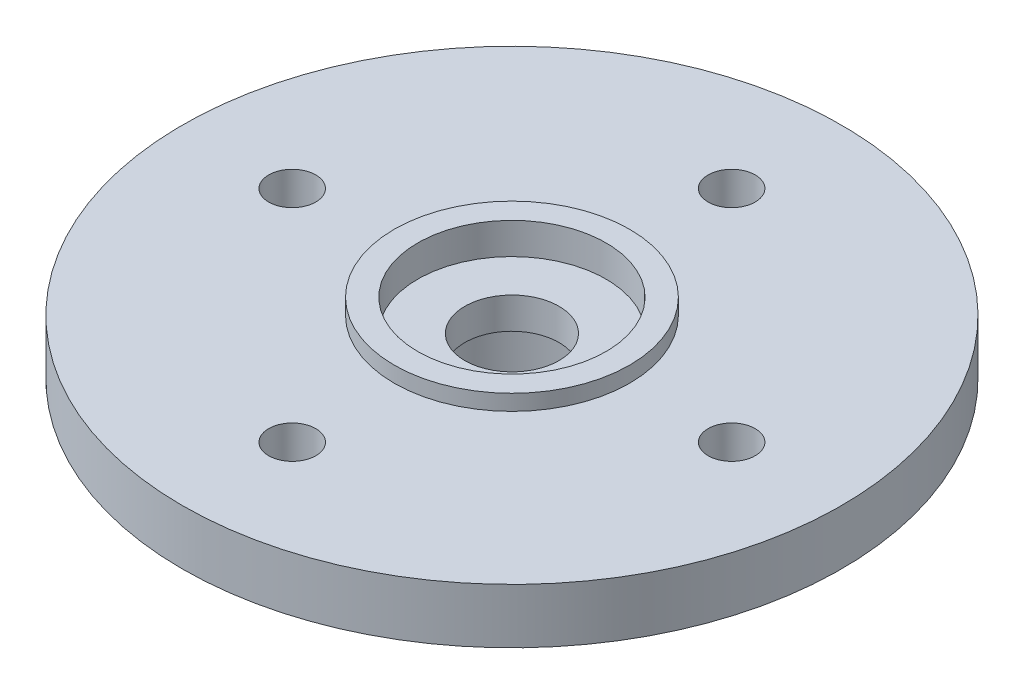
ISO-10303-21;
HEADER;
FILE_DESCRIPTION(('STEP AP214'),'2;1');
FILE_NAME('part.step','',(''),(''),'','','');
FILE_SCHEMA(('AUTOMOTIVE_DESIGN { 1 0 10303 214 1 1 1 1 }'));
ENDSEC;
DATA;
#1=APPLICATION_CONTEXT('core data for automotive mechanical design processes');
#2=APPLICATION_PROTOCOL_DEFINITION('international standard','automotive_design',2000,#1);
#3=PRODUCT_CONTEXT('',#1,'mechanical');
#4=PRODUCT('Part','Part','',(#3));
#5=PRODUCT_RELATED_PRODUCT_CATEGORY('part','',(#4));
#6=PRODUCT_DEFINITION_FORMATION('','',#4);
#7=PRODUCT_DEFINITION_CONTEXT('part definition',#1,'design');
#8=PRODUCT_DEFINITION('design','',#6,#7);
#9=PRODUCT_DEFINITION_SHAPE('','',#8);
#10=(LENGTH_UNIT() NAMED_UNIT(*) SI_UNIT(.MILLI.,.METRE.));
#11=(NAMED_UNIT(*) PLANE_ANGLE_UNIT() SI_UNIT($,.RADIAN.));
#12=(NAMED_UNIT(*) SI_UNIT($,.STERADIAN.) SOLID_ANGLE_UNIT());
#13=UNCERTAINTY_MEASURE_WITH_UNIT(LENGTH_MEASURE(1.E-05),#10,'distance_accuracy_value','');
#14=(GEOMETRIC_REPRESENTATION_CONTEXT(3) GLOBAL_UNCERTAINTY_ASSIGNED_CONTEXT((#13)) GLOBAL_UNIT_ASSIGNED_CONTEXT((#10,
#11,#12)) REPRESENTATION_CONTEXT('',''));
#15=CARTESIAN_POINT('',(0.,0.,0.));
#16=DIRECTION('',(0.,0.,1.));
#17=DIRECTION('',(1.,0.,0.));
#18=AXIS2_PLACEMENT_3D('',#15,#16,#17);
#19=CARTESIAN_POINT('',(0.,-1.75,0.));
#20=DIRECTION('',(0.,1.,0.));
#21=DIRECTION('',(0.,0.,1.));
#22=AXIS2_PLACEMENT_3D('',#19,#20,#21);
#23=CYLINDRICAL_SURFACE('',#22,10.5);
#24=CARTESIAN_POINT('',(0.,-1.75,0.));
#25=DIRECTION('',(0.,1.,0.));
#26=DIRECTION('',(0.,0.,1.));
#27=AXIS2_PLACEMENT_3D('',#24,#25,#26);
#28=CIRCLE('',#27,10.5);
#29=CARTESIAN_POINT('',(0.,-1.75,10.5));
#30=VERTEX_POINT('',#29);
#31=EDGE_CURVE('E10',#30,#30,#28,.T.);
#32=ORIENTED_EDGE('',*,*,#31,.T.);
#33=EDGE_LOOP('',(#32));
#34=FACE_BOUND('',#33,.T.);
#35=CARTESIAN_POINT('',(0.,0.,0.));
#36=DIRECTION('',(0.,1.,0.));
#37=DIRECTION('',(0.,0.,1.));
#38=AXIS2_PLACEMENT_3D('',#35,#36,#37);
#39=CIRCLE('',#38,10.5);
#40=CARTESIAN_POINT('',(0.,0.,10.5));
#41=VERTEX_POINT('',#40);
#42=EDGE_CURVE('E40',#41,#41,#39,.T.);
#43=ORIENTED_EDGE('',*,*,#42,.F.);
#44=EDGE_LOOP('',(#43));
#45=FACE_BOUND('',#44,.T.);
#46=ADVANCED_FACE('F33',(#34,#45),#23,.T.);
#47=CARTESIAN_POINT('',(10.5,-1.75,0.));
#48=DIRECTION('',(0.,-1.,0.));
#49=DIRECTION('',(0.,0.,-1.));
#50=AXIS2_PLACEMENT_3D('',#47,#48,#49);
#51=PLANE('',#50);
#52=CARTESIAN_POINT('',(7.,-1.75,0.));
#53=DIRECTION('',(0.,-1.,0.));
#54=DIRECTION('',(0.,0.,-1.));
#55=AXIS2_PLACEMENT_3D('',#52,#53,#54);
#56=CIRCLE('',#55,0.749999999999989);
#57=CARTESIAN_POINT('',(7.,-1.75,-0.750000000000038));
#58=VERTEX_POINT('',#57);
#59=EDGE_CURVE('E169',#58,#58,#56,.T.);
#60=ORIENTED_EDGE('',*,*,#59,.F.);
#61=EDGE_LOOP('',(#60));
#62=FACE_BOUND('',#61,.T.);
#63=CARTESIAN_POINT('',(0.,-1.75,-7.0000000000001));
#64=DIRECTION('',(0.,-1.,0.));
#65=DIRECTION('',(0.,0.,-1.));
#66=AXIS2_PLACEMENT_3D('',#63,#64,#65);
#67=CIRCLE('',#66,0.749999999999989);
#68=CARTESIAN_POINT('',(0.,-1.75,-7.75000000000009));
#69=VERTEX_POINT('',#68);
#70=EDGE_CURVE('E70',#69,#69,#67,.T.);
#71=ORIENTED_EDGE('',*,*,#70,.F.);
#72=EDGE_LOOP('',(#71));
#73=FACE_BOUND('',#72,.T.);
#74=CARTESIAN_POINT('',(-7.,-1.75,-1.51525461561973E-13));
#75=DIRECTION('',(0.,-1.,0.));
#76=DIRECTION('',(0.,0.,-1.));
#77=AXIS2_PLACEMENT_3D('',#74,#75,#76);
#78=CIRCLE('',#77,0.749999999999989);
#79=CARTESIAN_POINT('',(-7.,-1.75,-0.75000000000014));
#80=VERTEX_POINT('',#79);
#81=EDGE_CURVE('E60',#80,#80,#78,.T.);
#82=ORIENTED_EDGE('',*,*,#81,.F.);
#83=EDGE_LOOP('',(#82));
#84=FACE_BOUND('',#83,.T.);
#85=CARTESIAN_POINT('',(0.,-1.75,6.9999999999999));
#86=DIRECTION('',(0.,-1.,0.));
#87=DIRECTION('',(0.,0.,-1.));
#88=AXIS2_PLACEMENT_3D('',#85,#86,#87);
#89=CIRCLE('',#88,0.749999999999989);
#90=CARTESIAN_POINT('',(0.,-1.75,6.24999999999991));
#91=VERTEX_POINT('',#90);
#92=EDGE_CURVE('E57',#91,#91,#89,.T.);
#93=ORIENTED_EDGE('',*,*,#92,.F.);
#94=EDGE_LOOP('',(#93));
#95=FACE_BOUND('',#94,.T.);
#96=CARTESIAN_POINT('',(0.,-1.75,0.));
#97=DIRECTION('',(0.,-1.,0.));
#98=DIRECTION('',(0.,0.,-1.));
#99=AXIS2_PLACEMENT_3D('',#96,#97,#98);
#100=CIRCLE('',#99,4.45);
#101=CARTESIAN_POINT('',(0.,-1.75,-4.45));
#102=VERTEX_POINT('',#101);
#103=EDGE_CURVE('E90',#102,#102,#100,.T.);
#104=ORIENTED_EDGE('',*,*,#103,.F.);
#105=EDGE_LOOP('',(#104));
#106=FACE_BOUND('',#105,.T.);
#107=ORIENTED_EDGE('',*,*,#31,.F.);
#108=EDGE_LOOP('',(#107));
#109=FACE_BOUND('',#108,.T.);
#110=ADVANCED_FACE('F99',(#62,#73,#84,#95,#106,#109),#51,.T.);
#111=CARTESIAN_POINT('',(0.,0.,0.));
#112=DIRECTION('',(0.,1.,0.));
#113=DIRECTION('',(0.,0.,1.));
#114=AXIS2_PLACEMENT_3D('',#111,#112,#113);
#115=PLANE('',#114);
#116=CARTESIAN_POINT('',(7.,0.,0.));
#117=DIRECTION('',(0.,1.,0.));
#118=DIRECTION('',(0.,0.,1.));
#119=AXIS2_PLACEMENT_3D('',#116,#117,#118);
#120=CIRCLE('',#119,0.749999999999994);
#121=CARTESIAN_POINT('',(7.,0.,0.749999999999945));
#122=VERTEX_POINT('',#121);
#123=EDGE_CURVE('E167',#122,#122,#120,.T.);
#124=ORIENTED_EDGE('',*,*,#123,.F.);
#125=EDGE_LOOP('',(#124));
#126=FACE_BOUND('',#125,.T.);
#127=CARTESIAN_POINT('',(0.,0.,-7.0000000000001));
#128=DIRECTION('',(0.,1.,0.));
#129=DIRECTION('',(0.,0.,1.));
#130=AXIS2_PLACEMENT_3D('',#127,#128,#129);
#131=CIRCLE('',#130,0.749999999999994);
#132=CARTESIAN_POINT('',(0.,0.,-6.25000000000011));
#133=VERTEX_POINT('',#132);
#134=EDGE_CURVE('E36',#133,#133,#131,.T.);
#135=ORIENTED_EDGE('',*,*,#134,.F.);
#136=EDGE_LOOP('',(#135));
#137=FACE_BOUND('',#136,.T.);
#138=CARTESIAN_POINT('',(-7.,0.,-1.51525461561973E-13));
#139=DIRECTION('',(0.,1.,0.));
#140=DIRECTION('',(0.,0.,1.));
#141=AXIS2_PLACEMENT_3D('',#138,#139,#140);
#142=CIRCLE('',#141,0.749999999999994);
#143=CARTESIAN_POINT('',(-7.,0.,0.749999999999843));
#144=VERTEX_POINT('',#143);
#145=EDGE_CURVE('E58',#144,#144,#142,.T.);
#146=ORIENTED_EDGE('',*,*,#145,.F.);
#147=EDGE_LOOP('',(#146));
#148=FACE_BOUND('',#147,.T.);
#149=CARTESIAN_POINT('',(0.,0.,6.9999999999999));
#150=DIRECTION('',(0.,1.,0.));
#151=DIRECTION('',(0.,0.,1.));
#152=AXIS2_PLACEMENT_3D('',#149,#150,#151);
#153=CIRCLE('',#152,0.749999999999994);
#154=CARTESIAN_POINT('',(0.,0.,7.7499999999999));
#155=VERTEX_POINT('',#154);
#156=EDGE_CURVE('E54',#155,#155,#153,.T.);
#157=ORIENTED_EDGE('',*,*,#156,.F.);
#158=EDGE_LOOP('',(#157));
#159=FACE_BOUND('',#158,.T.);
#160=CARTESIAN_POINT('',(0.,0.,0.));
#161=DIRECTION('',(0.,1.,0.));
#162=DIRECTION('',(0.,0.,1.));
#163=AXIS2_PLACEMENT_3D('',#160,#161,#162);
#164=CIRCLE('',#163,3.75);
#165=CARTESIAN_POINT('',(0.,0.,3.75));
#166=VERTEX_POINT('',#165);
#167=EDGE_CURVE('E52',#166,#166,#164,.T.);
#168=ORIENTED_EDGE('',*,*,#167,.F.);
#169=EDGE_LOOP('',(#168));
#170=FACE_BOUND('',#169,.T.);
#171=ORIENTED_EDGE('',*,*,#42,.T.);
#172=EDGE_LOOP('',(#171));
#173=FACE_BOUND('',#172,.T.);
#174=ADVANCED_FACE('F102',(#126,#137,#148,#159,#170,#173),#115,.T.);
#175=CARTESIAN_POINT('',(0.,-4.25,0.));
#176=DIRECTION('',(0.,1.,0.));
#177=DIRECTION('',(0.,0.,1.));
#178=AXIS2_PLACEMENT_3D('',#175,#176,#177);
#179=CYLINDRICAL_SURFACE('',#178,4.45);
#180=CARTESIAN_POINT('',(0.,-4.25,0.));
#181=DIRECTION('',(0.,-1.,0.));
#182=DIRECTION('',(0.,0.,-1.));
#183=AXIS2_PLACEMENT_3D('',#180,#181,#182);
#184=CIRCLE('',#183,4.45);
#185=CARTESIAN_POINT('',(0.,-4.25,-4.45));
#186=VERTEX_POINT('',#185);
#187=EDGE_CURVE('E45',#186,#186,#184,.T.);
#188=ORIENTED_EDGE('',*,*,#187,.F.);
#189=EDGE_LOOP('',(#188));
#190=FACE_BOUND('',#189,.T.);
#191=ORIENTED_EDGE('',*,*,#103,.T.);
#192=EDGE_LOOP('',(#191));
#193=FACE_BOUND('',#192,.T.);
#194=ADVANCED_FACE('F97',(#190,#193),#179,.T.);
#195=CARTESIAN_POINT('',(0.,-4.25,0.));
#196=DIRECTION('',(0.,-1.,0.));
#197=DIRECTION('',(0.,0.,-1.));
#198=AXIS2_PLACEMENT_3D('',#195,#196,#197);
#199=PLANE('',#198);
#200=CARTESIAN_POINT('',(0.,-4.25,0.));
#201=DIRECTION('',(0.,-1.,0.));
#202=DIRECTION('',(0.,0.,-1.));
#203=AXIS2_PLACEMENT_3D('',#200,#201,#202);
#204=CIRCLE('',#203,3.);
#205=CARTESIAN_POINT('',(0.,-4.25,-3.));
#206=VERTEX_POINT('',#205);
#207=EDGE_CURVE('E49',#206,#206,#204,.T.);
#208=ORIENTED_EDGE('',*,*,#207,.F.);
#209=EDGE_LOOP('',(#208));
#210=FACE_BOUND('',#209,.T.);
#211=ORIENTED_EDGE('',*,*,#187,.T.);
#212=EDGE_LOOP('',(#211));
#213=FACE_BOUND('',#212,.T.);
#214=ADVANCED_FACE('F115',(#210,#213),#199,.T.);
#215=CARTESIAN_POINT('',(0.,0.5,0.));
#216=DIRECTION('',(0.,-1.,0.));
#217=DIRECTION('',(0.,0.,-1.));
#218=AXIS2_PLACEMENT_3D('',#215,#216,#217);
#219=CYLINDRICAL_SURFACE('',#218,3.75);
#220=CARTESIAN_POINT('',(0.,0.5,0.));
#221=DIRECTION('',(0.,1.,0.));
#222=DIRECTION('',(0.,0.,1.));
#223=AXIS2_PLACEMENT_3D('',#220,#221,#222);
#224=CIRCLE('',#223,3.75);
#225=CARTESIAN_POINT('',(0.,0.5,3.75));
#226=VERTEX_POINT('',#225);
#227=EDGE_CURVE('E87',#226,#226,#224,.T.);
#228=ORIENTED_EDGE('',*,*,#227,.F.);
#229=EDGE_LOOP('',(#228));
#230=FACE_BOUND('',#229,.T.);
#231=ORIENTED_EDGE('',*,*,#167,.T.);
#232=EDGE_LOOP('',(#231));
#233=FACE_BOUND('',#232,.T.);
#234=ADVANCED_FACE('F119',(#230,#233),#219,.T.);
#235=CARTESIAN_POINT('',(0.,0.5,0.));
#236=DIRECTION('',(0.,1.,0.));
#237=DIRECTION('',(0.,0.,1.));
#238=AXIS2_PLACEMENT_3D('',#235,#236,#237);
#239=PLANE('',#238);
#240=CARTESIAN_POINT('',(0.,0.5,0.));
#241=DIRECTION('',(0.,1.,0.));
#242=DIRECTION('',(0.,0.,1.));
#243=AXIS2_PLACEMENT_3D('',#240,#241,#242);
#244=CIRCLE('',#243,3.);
#245=CARTESIAN_POINT('',(0.,0.5,3.));
#246=VERTEX_POINT('',#245);
#247=EDGE_CURVE('E53',#246,#246,#244,.T.);
#248=ORIENTED_EDGE('',*,*,#247,.F.);
#249=EDGE_LOOP('',(#248));
#250=FACE_BOUND('',#249,.T.);
#251=ORIENTED_EDGE('',*,*,#227,.T.);
#252=EDGE_LOOP('',(#251));
#253=FACE_BOUND('',#252,.T.);
#254=ADVANCED_FACE('F123',(#250,#253),#239,.T.);
#255=CARTESIAN_POINT('',(0.,-4.5,0.));
#256=DIRECTION('',(0.,1.,0.));
#257=DIRECTION('',(0.,0.,1.));
#258=AXIS2_PLACEMENT_3D('',#255,#256,#257);
#259=CYLINDRICAL_SURFACE('',#258,3.);
#260=ORIENTED_EDGE('',*,*,#207,.T.);
#261=EDGE_LOOP('',(#260));
#262=FACE_BOUND('',#261,.T.);
#263=CARTESIAN_POINT('',(0.,-1.5,0.));
#264=DIRECTION('',(0.,1.,0.));
#265=DIRECTION('',(0.,0.,1.));
#266=AXIS2_PLACEMENT_3D('',#263,#264,#265);
#267=CIRCLE('',#266,3.);
#268=CARTESIAN_POINT('',(0.,-1.5,3.));
#269=VERTEX_POINT('',#268);
#270=EDGE_CURVE('E56',#269,#269,#267,.T.);
#271=ORIENTED_EDGE('',*,*,#270,.T.);
#272=EDGE_LOOP('',(#271));
#273=FACE_BOUND('',#272,.T.);
#274=ADVANCED_FACE('F127',(#262,#273),#259,.F.);
#275=CARTESIAN_POINT('',(0.,-4.5,0.));
#276=DIRECTION('',(0.,1.,0.));
#277=DIRECTION('',(0.,0.,1.));
#278=AXIS2_PLACEMENT_3D('',#275,#276,#277);
#279=CYLINDRICAL_SURFACE('',#278,3.);
#280=CARTESIAN_POINT('',(0.,-0.5,0.));
#281=DIRECTION('',(0.,1.,0.));
#282=DIRECTION('',(0.,0.,1.));
#283=AXIS2_PLACEMENT_3D('',#280,#281,#282);
#284=CIRCLE('',#283,3.);
#285=CARTESIAN_POINT('',(0.,-0.5,3.));
#286=VERTEX_POINT('',#285);
#287=EDGE_CURVE('E82',#286,#286,#284,.T.);
#288=ORIENTED_EDGE('',*,*,#287,.F.);
#289=EDGE_LOOP('',(#288));
#290=FACE_BOUND('',#289,.T.);
#291=ORIENTED_EDGE('',*,*,#247,.T.);
#292=EDGE_LOOP('',(#291));
#293=FACE_BOUND('',#292,.T.);
#294=ADVANCED_FACE('F131',(#290,#293),#279,.F.);
#295=CARTESIAN_POINT('',(3.,-0.5,0.));
#296=DIRECTION('',(0.,-1.,0.));
#297=DIRECTION('',(0.,0.,-1.));
#298=AXIS2_PLACEMENT_3D('',#295,#296,#297);
#299=PLANE('',#298);
#300=CARTESIAN_POINT('',(0.,-0.5,0.));
#301=DIRECTION('',(0.,1.,0.));
#302=DIRECTION('',(0.,0.,1.));
#303=AXIS2_PLACEMENT_3D('',#300,#301,#302);
#304=CIRCLE('',#303,1.50059311321815);
#305=CARTESIAN_POINT('',(0.,-0.5,1.50059311321815));
#306=VERTEX_POINT('',#305);
#307=EDGE_CURVE('E79',#306,#306,#304,.T.);
#308=ORIENTED_EDGE('',*,*,#307,.F.);
#309=EDGE_LOOP('',(#308));
#310=FACE_BOUND('',#309,.T.);
#311=ORIENTED_EDGE('',*,*,#287,.T.);
#312=EDGE_LOOP('',(#311));
#313=FACE_BOUND('',#312,.T.);
#314=ADVANCED_FACE('F135',(#310,#313),#299,.F.);
#315=CARTESIAN_POINT('',(0.,-4.5,0.));
#316=DIRECTION('',(0.,1.,0.));
#317=DIRECTION('',(0.,0.,1.));
#318=AXIS2_PLACEMENT_3D('',#315,#316,#317);
#319=CYLINDRICAL_SURFACE('',#318,1.50059311321815);
#320=CARTESIAN_POINT('',(0.,-1.5,0.));
#321=DIRECTION('',(0.,1.,0.));
#322=DIRECTION('',(0.,0.,1.));
#323=AXIS2_PLACEMENT_3D('',#320,#321,#322);
#324=CIRCLE('',#323,1.50059311321815);
#325=CARTESIAN_POINT('',(0.,-1.5,1.50059311321815));
#326=VERTEX_POINT('',#325);
#327=EDGE_CURVE('E76',#326,#326,#324,.T.);
#328=ORIENTED_EDGE('',*,*,#327,.F.);
#329=EDGE_LOOP('',(#328));
#330=FACE_BOUND('',#329,.T.);
#331=ORIENTED_EDGE('',*,*,#307,.T.);
#332=EDGE_LOOP('',(#331));
#333=FACE_BOUND('',#332,.T.);
#334=ADVANCED_FACE('F139',(#330,#333),#319,.F.);
#335=CARTESIAN_POINT('',(1.50059311321815,-1.5,0.));
#336=DIRECTION('',(0.,1.,0.));
#337=DIRECTION('',(0.,0.,1.));
#338=AXIS2_PLACEMENT_3D('',#335,#336,#337);
#339=PLANE('',#338);
#340=ORIENTED_EDGE('',*,*,#270,.F.);
#341=EDGE_LOOP('',(#340));
#342=FACE_BOUND('',#341,.T.);
#343=ORIENTED_EDGE('',*,*,#327,.T.);
#344=EDGE_LOOP('',(#343));
#345=FACE_BOUND('',#344,.T.);
#346=ADVANCED_FACE('F143',(#342,#345),#339,.F.);
#347=CARTESIAN_POINT('',(0.,-1.75,6.9999999999999));
#348=DIRECTION('',(0.,-1.,0.));
#349=DIRECTION('',(0.,0.,-1.));
#350=AXIS2_PLACEMENT_3D('',#347,#348,#349);
#351=CYLINDRICAL_SURFACE('',#350,0.749999999999994);
#352=ORIENTED_EDGE('',*,*,#156,.T.);
#353=EDGE_LOOP('',(#352));
#354=FACE_BOUND('',#353,.T.);
#355=ORIENTED_EDGE('',*,*,#92,.T.);
#356=EDGE_LOOP('',(#355));
#357=FACE_BOUND('',#356,.T.);
#358=ADVANCED_FACE('F147',(#354,#357),#351,.F.);
#359=CARTESIAN_POINT('',(-7.,-1.75,-1.51525461561973E-13));
#360=DIRECTION('',(0.,-1.,0.));
#361=DIRECTION('',(0.,0.,-1.));
#362=AXIS2_PLACEMENT_3D('',#359,#360,#361);
#363=CYLINDRICAL_SURFACE('',#362,0.749999999999994);
#364=ORIENTED_EDGE('',*,*,#145,.T.);
#365=EDGE_LOOP('',(#364));
#366=FACE_BOUND('',#365,.T.);
#367=ORIENTED_EDGE('',*,*,#81,.T.);
#368=EDGE_LOOP('',(#367));
#369=FACE_BOUND('',#368,.T.);
#370=ADVANCED_FACE('F151',(#366,#369),#363,.F.);
#371=CARTESIAN_POINT('',(0.,-1.75,-7.0000000000001));
#372=DIRECTION('',(0.,-1.,0.));
#373=DIRECTION('',(0.,0.,-1.));
#374=AXIS2_PLACEMENT_3D('',#371,#372,#373);
#375=CYLINDRICAL_SURFACE('',#374,0.749999999999994);
#376=ORIENTED_EDGE('',*,*,#134,.T.);
#377=EDGE_LOOP('',(#376));
#378=FACE_BOUND('',#377,.T.);
#379=ORIENTED_EDGE('',*,*,#70,.T.);
#380=EDGE_LOOP('',(#379));
#381=FACE_BOUND('',#380,.T.);
#382=ADVANCED_FACE('F155',(#378,#381),#375,.F.);
#383=CARTESIAN_POINT('',(7.,-1.75,0.));
#384=DIRECTION('',(0.,-1.,0.));
#385=DIRECTION('',(0.,0.,-1.));
#386=AXIS2_PLACEMENT_3D('',#383,#384,#385);
#387=CYLINDRICAL_SURFACE('',#386,0.749999999999994);
#388=ORIENTED_EDGE('',*,*,#123,.T.);
#389=EDGE_LOOP('',(#388));
#390=FACE_BOUND('',#389,.T.);
#391=ORIENTED_EDGE('',*,*,#59,.T.);
#392=EDGE_LOOP('',(#391));
#393=FACE_BOUND('',#392,.T.);
#394=ADVANCED_FACE('F158',(#390,#393),#387,.F.);
#395=CLOSED_SHELL('',(#46,#110,#174,#194,#214,#234,#254,#274,#294,#314,#334,#346,#358,#370,#382,#394));
#396=MANIFOLD_SOLID_BREP('B2',#395);
#397=ADVANCED_BREP_SHAPE_REPRESENTATION('',(#18,#396),#14);
#398=SHAPE_DEFINITION_REPRESENTATION(#9,#397);
ENDSEC;
END-ISO-10303-21;
